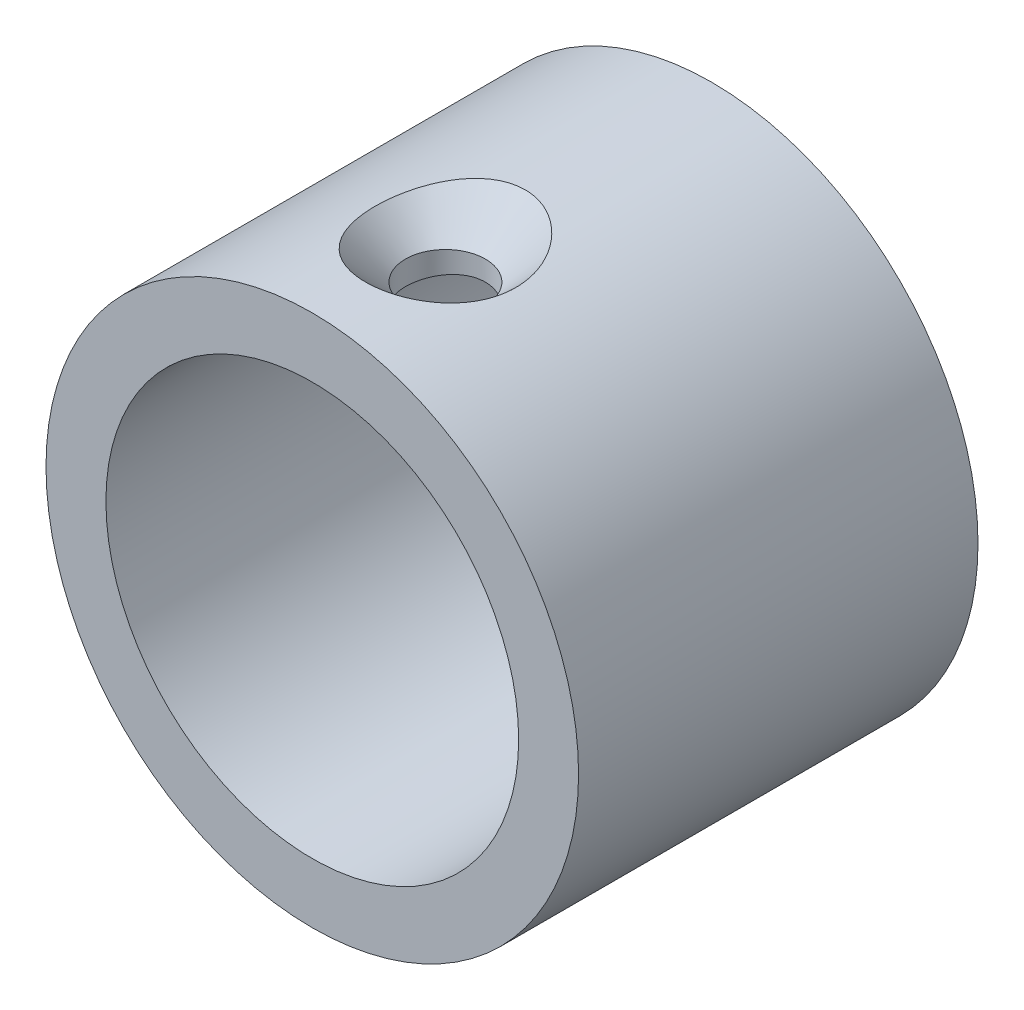
ISO-10303-21;
HEADER;
FILE_DESCRIPTION(('STEP AP214'),'2;1');
FILE_NAME('part.step','',(''),(''),'','','');
FILE_SCHEMA(('AUTOMOTIVE_DESIGN { 1 0 10303 214 1 1 1 1 }'));
ENDSEC;
DATA;
#1=APPLICATION_CONTEXT('core data for automotive mechanical design processes');
#2=APPLICATION_PROTOCOL_DEFINITION('international standard','automotive_design',2000,#1);
#3=PRODUCT_CONTEXT('',#1,'mechanical');
#4=PRODUCT('Part','Part','',(#3));
#5=PRODUCT_RELATED_PRODUCT_CATEGORY('part','',(#4));
#6=PRODUCT_DEFINITION_FORMATION('','',#4);
#7=PRODUCT_DEFINITION_CONTEXT('part definition',#1,'design');
#8=PRODUCT_DEFINITION('design','',#6,#7);
#9=PRODUCT_DEFINITION_SHAPE('','',#8);
#10=(LENGTH_UNIT() NAMED_UNIT(*) SI_UNIT(.MILLI.,.METRE.));
#11=(NAMED_UNIT(*) PLANE_ANGLE_UNIT() SI_UNIT($,.RADIAN.));
#12=(NAMED_UNIT(*) SI_UNIT($,.STERADIAN.) SOLID_ANGLE_UNIT());
#13=UNCERTAINTY_MEASURE_WITH_UNIT(LENGTH_MEASURE(1.E-05),#10,'distance_accuracy_value','');
#14=(GEOMETRIC_REPRESENTATION_CONTEXT(3) GLOBAL_UNCERTAINTY_ASSIGNED_CONTEXT((#13)) GLOBAL_UNIT_ASSIGNED_CONTEXT((#10,
#11,#12)) REPRESENTATION_CONTEXT('',''));
#15=CARTESIAN_POINT('',(0.,0.,0.));
#16=DIRECTION('',(0.,0.,1.));
#17=DIRECTION('',(1.,0.,0.));
#18=AXIS2_PLACEMENT_3D('',#15,#16,#17);
#19=CARTESIAN_POINT('',(0.,-1.11022302462516E-13,15.));
#20=DIRECTION('',(0.,0.,-1.));
#21=DIRECTION('',(-1.,0.,0.));
#22=AXIS2_PLACEMENT_3D('',#19,#20,#21);
#23=CYLINDRICAL_SURFACE('',#22,15.5);
#24=CARTESIAN_POINT('',(0.,15.5000000000001,7.99999999999995));
#25=CARTESIAN_POINT('',(-0.166842157427966,15.499996948164,7.99999373463535));
#26=CARTESIAN_POINT('',(-0.333764718614801,15.4972784289912,7.98603481731262));
#27=CARTESIAN_POINT('',(-0.662899184251405,15.4866958346927,7.93060790674575));
#28=CARTESIAN_POINT('',(-0.825107110075494,15.478827538276,7.88911734532683));
#29=CARTESIAN_POINT('',(-1.14000531508913,15.4588248154496,7.77995076067469));
#30=CARTESIAN_POINT('',(-1.29270428589321,15.4466943542873,7.71229907023018));
#31=CARTESIAN_POINT('',(-1.584571985674,15.4194891035625,7.55280123803706));
#32=CARTESIAN_POINT('',(-1.72374167048589,15.4044145222269,7.46095680719286));
#33=CARTESIAN_POINT('',(-1.9863833519088,15.3727681810538,7.25444093448922));
#34=CARTESIAN_POINT('',(-2.10965836266254,15.356181315792,7.1395212604454));
#35=CARTESIAN_POINT('',(-2.33530650469372,15.3234909013097,6.8906508609874));
#36=CARTESIAN_POINT('',(-2.43767807324439,15.3073873883011,6.75669871398735));
#37=CARTESIAN_POINT('',(-2.61944182004037,15.277339838046,6.47216181736862));
#38=CARTESIAN_POINT('',(-2.69863190503116,15.2634152580192,6.32144573343913));
#39=CARTESIAN_POINT('',(-2.83049059332961,15.2395158213961,6.00853375131921));
#40=CARTESIAN_POINT('',(-2.88316164147315,15.2295406007196,5.84633891294804));
#41=CARTESIAN_POINT('',(-2.95985143513911,15.2148217351821,5.5171868744315));
#42=CARTESIAN_POINT('',(-2.98421471391812,15.2100152367751,5.35031281492139));
#43=CARTESIAN_POINT('',(-3.00466715052272,15.205988677396,5.01478171365623));
#44=CARTESIAN_POINT('',(-3.00075901257164,15.2067680821199,4.84612484397186));
#45=CARTESIAN_POINT('',(-2.96505853774272,15.2137680971283,4.51432344159952));
#46=CARTESIAN_POINT('',(-2.93365948718622,15.2199119598443,4.35113473349615));
#47=CARTESIAN_POINT('',(-2.84448853402006,15.2368279427301,4.03238592998802));
#48=CARTESIAN_POINT('',(-2.78671544440239,15.2476002712105,3.87682617828628));
#49=CARTESIAN_POINT('',(-2.64605609709233,15.2726388046614,3.5766085829707));
#50=CARTESIAN_POINT('',(-2.56301242832955,15.2869267988358,3.43202638273262));
#51=CARTESIAN_POINT('',(-2.37428042851861,15.3173725601596,3.15870107799083));
#52=CARTESIAN_POINT('',(-2.26858965404571,15.3335305289764,3.02995968493304));
#53=CARTESIAN_POINT('',(-2.03545019647664,15.3662291402573,2.78969958237448));
#54=CARTESIAN_POINT('',(-1.90766546574733,15.3827716481717,2.67850695826146));
#55=CARTESIAN_POINT('',(-1.63508621521035,15.4141260938881,2.47908552820961));
#56=CARTESIAN_POINT('',(-1.49029150298899,15.4289380121101,2.39085698207241));
#57=CARTESIAN_POINT('',(-1.18745182950821,15.455195302749,2.23981431795428));
#58=CARTESIAN_POINT('',(-1.0293887211504,15.4666359646592,2.17703571449017));
#59=CARTESIAN_POINT('',(-0.704689196561309,15.4848256128898,2.07901322573999));
#60=CARTESIAN_POINT('',(-0.53805375408951,15.4915751308342,2.04376622037855));
#61=CARTESIAN_POINT('',(-0.203743604968224,15.4995484969183,2.00226504310537));
#62=CARTESIAN_POINT('',(-0.0361262957914658,15.5008574403624,1.99556434037485));
#63=CARTESIAN_POINT('',(0.297833265059787,15.4980378538656,2.01014592167347));
#64=CARTESIAN_POINT('',(0.464175583205138,15.4939096093551,2.03142673678491));
#65=CARTESIAN_POINT('',(0.789435450825461,15.4807326144716,2.10099614470907));
#66=CARTESIAN_POINT('',(0.948403476814254,15.4717253214162,2.14905728219946));
#67=CARTESIAN_POINT('',(1.25602495081128,15.4497962342172,2.27057576676314));
#68=CARTESIAN_POINT('',(1.40467766243839,15.436874160961,2.3440349246945));
#69=CARTESIAN_POINT('',(1.68934378804748,15.4083367239648,2.51524188455162));
#70=CARTESIAN_POINT('',(1.82519124255932,15.3926919549644,2.61326062437702));
#71=CARTESIAN_POINT('',(2.07866993264157,15.3605171123707,2.8304395692217));
#72=CARTESIAN_POINT('',(2.19629934544861,15.3439869504138,2.94960188715608));
#73=CARTESIAN_POINT('',(2.4117123454532,15.3116199014331,3.20771236560398));
#74=CARTESIAN_POINT('',(2.50919032448032,15.2957961959995,3.34691751282671));
#75=CARTESIAN_POINT('',(2.67938023850923,15.2669055094524,3.63998847715985));
#76=CARTESIAN_POINT('',(2.75209312933825,15.2538384219526,3.7938537281591));
#77=CARTESIAN_POINT('',(2.87026314421333,15.2320453568303,4.11112581716569));
#78=CARTESIAN_POINT('',(2.91585659894345,15.2232977036019,4.27448031878354));
#79=CARTESIAN_POINT('',(2.97891074851143,15.2110861081522,4.60671767852867));
#80=CARTESIAN_POINT('',(2.99637485106529,15.2076215259186,4.77559986447789));
#81=CARTESIAN_POINT('',(3.00255473934854,15.2064022777368,5.11103410478418));
#82=CARTESIAN_POINT('',(2.99175298257696,15.2085517861519,5.27757711155849));
#83=CARTESIAN_POINT('',(2.94276810273009,15.2181052690478,5.60642486132709));
#84=CARTESIAN_POINT('',(2.90458516935898,15.2255092071245,5.76872963367694));
#85=CARTESIAN_POINT('',(2.80213097225149,15.2446957641508,6.08421153742388));
#86=CARTESIAN_POINT('',(2.73791525329956,15.256469055947,6.23740731114776));
#87=CARTESIAN_POINT('',(2.58527230966198,15.2830737402167,6.53092687576328));
#88=CARTESIAN_POINT('',(2.49684322088532,15.2979053681177,6.67124967450493));
#89=CARTESIAN_POINT('',(2.29662044140757,15.3292510094655,6.93744995811736));
#90=CARTESIAN_POINT('',(2.18447690677593,15.3457880646324,7.06306164094173));
#91=CARTESIAN_POINT('',(1.9407347135171,15.3785122377946,7.2938442667665));
#92=CARTESIAN_POINT('',(1.80913159216237,15.3946992745404,7.39901050811008));
#93=CARTESIAN_POINT('',(1.52867568383951,15.4250840481721,7.58687409987819));
#94=CARTESIAN_POINT('',(1.37966809614722,15.4392609875134,7.66934383790452));
#95=CARTESIAN_POINT('',(1.06968135596581,15.4638244158092,7.80794448195346));
#96=CARTESIAN_POINT('',(0.908713391860636,15.4742143948633,7.86409965344656));
#97=CARTESIAN_POINT('',(0.622770386768138,15.4879623450641,7.93732505932674));
#98=CARTESIAN_POINT('',(0.499446623212571,15.4924505344118,7.96078717353864));
#99=CARTESIAN_POINT('',(0.250763676068821,15.4984704668632,7.99212677736904));
#100=CARTESIAN_POINT('',(0.125404550346819,15.5000022938695,8.00000470927273));
#101=CARTESIAN_POINT('',(0.,15.5000000000001,7.99999999999995));
#102=B_SPLINE_CURVE_WITH_KNOTS('',3,(#24,#25,#26,#27,#28,#29,#30,#31,#32,#33,#34,#35,#36,#37,
#38,#39,#40,#41,#42,#43,#44,#45,#46,#47,#48,#49,#50,#51,#52,#53,#54,#55,#56,#57,#58,#59,#60,#61,
#62,#63,#64,#65,#66,#67,#68,#69,#70,#71,#72,#73,#74,#75,#76,#77,#78,#79,#80,#81,#82,#83,#84,#85,
#86,#87,#88,#89,#90,#91,#92,#93,#94,#95,#96,#97,#98,#99,#100,#101),.UNSPECIFIED.,.T.,.F.,(4,2,2,
2,2,2,2,2,2,2,2,2,2,2,2,2,2,2,2,2,2,2,2,2,2,2,2,2,2,2,2,2,2,2,2,2,2,2,4),(0.,0.50006778655813,
1.00054599472548,1.50055981725489,2.00053828842381,2.50621507597948,3.01192965374993,
3.5219299583499,4.03188323652634,4.53556262536378,5.03919383679439,5.53573568336897,
6.03229987984826,6.53202279943104,7.03179966192038,7.53998224519339,8.04817057748541,
8.55706564795433,9.06590303846506,9.56675110957221,10.0675728892097,10.5642044495582,
11.060871426635,11.5632793855914,12.0657375793678,12.5753323838774,13.0849075179622,
13.5918988558482,14.0988287699066,14.5971627829493,15.0954933434327,15.592766191817,
16.0900773340282,16.5953127247585,17.1006641629152,17.6109127481924,18.1206898871514,
18.4965694413089,18.8724383277043),.UNSPECIFIED.);
#103=CARTESIAN_POINT('',(0.,15.5000000000001,7.99999999999995));
#104=VERTEX_POINT('',#103);
#105=EDGE_CURVE('E37',#104,#104,#102,.T.);
#106=ORIENTED_EDGE('',*,*,#105,.F.);
#107=EDGE_LOOP('',(#106));
#108=FACE_BOUND('',#107,.T.);
#109=CARTESIAN_POINT('',(0.,-1.11022302462516E-13,15.));
#110=DIRECTION('',(0.,0.,-1.));
#111=DIRECTION('',(1.,0.,0.));
#112=AXIS2_PLACEMENT_3D('',#109,#110,#111);
#113=CIRCLE('',#112,15.5);
#114=CARTESIAN_POINT('',(15.5,-1.34253719252797E-13,15.));
#115=VERTEX_POINT('',#114);
#116=EDGE_CURVE('E10',#115,#115,#113,.T.);
#117=ORIENTED_EDGE('',*,*,#116,.F.);
#118=EDGE_LOOP('',(#117));
#119=FACE_BOUND('',#118,.T.);
#120=CARTESIAN_POINT('',(4.44089209850063E-13,-3.33066907387547E-13,-15.0000000000001));
#121=DIRECTION('',(0.,0.,-1.));
#122=DIRECTION('',(1.,0.,0.));
#123=AXIS2_PLACEMENT_3D('',#120,#121,#122);
#124=CIRCLE('',#123,15.5);
#125=CARTESIAN_POINT('',(15.5000000000005,-3.56298324177828E-13,-15.));
#126=VERTEX_POINT('',#125);
#127=EDGE_CURVE('E26',#126,#126,#124,.T.);
#128=ORIENTED_EDGE('',*,*,#127,.T.);
#129=EDGE_LOOP('',(#128));
#130=FACE_BOUND('',#129,.T.);
#131=ADVANCED_FACE('F14',(#108,#119,#130),#23,.F.);
#132=CARTESIAN_POINT('',(0.,-1.11022302462516E-13,15.));
#133=DIRECTION('',(0.,0.,-1.));
#134=DIRECTION('',(-1.,0.,0.));
#135=AXIS2_PLACEMENT_3D('',#132,#133,#134);
#136=CYLINDRICAL_SURFACE('',#135,20.);
#137=CARTESIAN_POINT('',(-4.4260156111422,19.5041121138466,1.72805339375556));
#138=CARTESIAN_POINT('',(-4.51460594732798,19.4840084994002,1.88170713248954));
#139=CARTESIAN_POINT('',(-4.59660976123532,19.4647674683411,2.0392446963576));
#140=CARTESIAN_POINT('',(-4.74721450727494,19.4285860517931,2.36092504262204));
#141=CARTESIAN_POINT('',(-4.81581085962616,19.4116464530381,2.52507005901311));
#142=CARTESIAN_POINT('',(-4.93938948497811,19.3805701148185,2.85887050378123));
#143=CARTESIAN_POINT('',(-4.99435627538918,19.3664365665032,3.02853195346612));
#144=CARTESIAN_POINT('',(-5.09039596182385,19.3414149925463,3.37204346366767));
#145=CARTESIAN_POINT('',(-5.13146365141808,19.3305281832737,3.54589506769985));
#146=CARTESIAN_POINT('',(-5.19960662371508,19.3123105709696,3.89695731881611));
#147=CARTESIAN_POINT('',(-5.22664638818265,19.3049887973382,4.07417532606232));
#148=CARTESIAN_POINT('',(-5.26647686684826,19.2941609906851,4.43038474286673));
#149=CARTESIAN_POINT('',(-5.27926246477564,19.2906563277553,4.60937676593367));
#150=CARTESIAN_POINT('',(-5.2905111804254,19.2875743873263,4.96771642692102));
#151=CARTESIAN_POINT('',(-5.28898448554911,19.2879943163262,5.14706372106362));
#152=CARTESIAN_POINT('',(-5.27163627693439,19.2927429642587,5.50507929757878));
#153=CARTESIAN_POINT('',(-5.25580950166301,19.2970731219099,5.68374730571637));
#154=CARTESIAN_POINT('',(-5.2094984460719,19.3096274593391,6.04235739091274));
#155=CARTESIAN_POINT('',(-5.17875205398456,19.3179212319233,6.2222632554814));
#156=CARTESIAN_POINT('',(-5.10260800459844,19.3381731821322,6.57880502508561));
#157=CARTESIAN_POINT('',(-5.05720515633979,19.3501326579838,6.75543974809101));
#158=CARTESIAN_POINT('',(-4.95191977034455,19.3773436134913,7.10411532451887));
#159=CARTESIAN_POINT('',(-4.89203480888611,19.3925956441422,7.2761554036258));
#160=CARTESIAN_POINT('',(-4.75801508246824,19.4259120177889,7.61430931106661));
#161=CARTESIAN_POINT('',(-4.68388085172908,19.4439762553473,7.78042336129689));
#162=CARTESIAN_POINT('',(-4.52232123070088,19.4821826069655,8.10403014275748));
#163=CARTESIAN_POINT('',(-4.43501433202277,19.5023057276181,8.26158421740204));
#164=CARTESIAN_POINT('',(-4.24700803674685,19.5441088016919,8.56818602384206));
#165=CARTESIAN_POINT('',(-4.14631461519155,19.5657880585608,8.71723750857541));
#166=CARTESIAN_POINT('',(-3.93183364591797,19.6100146867916,9.00559148653741));
#167=CARTESIAN_POINT('',(-3.81803995528791,19.6325624620903,9.14488935651054));
#168=CARTESIAN_POINT('',(-3.57793696280021,19.6777354945794,9.41211743971777));
#169=CARTESIAN_POINT('',(-3.45163488011778,19.7003606998849,9.54005413007271));
#170=CARTESIAN_POINT('',(-3.19543384845572,19.7434797488704,9.77542156613769));
#171=CARTESIAN_POINT('',(-3.06626334076158,19.7640180487561,9.88363652819323));
#172=CARTESIAN_POINT('',(-2.79819033488612,19.8037489226803,10.0873922957867));
#173=CARTESIAN_POINT('',(-2.6592938801579,19.8229423178301,10.1829408669494));
#174=CARTESIAN_POINT('',(-2.37270394534761,19.8592828975,10.3599896504111));
#175=CARTESIAN_POINT('',(-2.2250177560268,19.8764317433919,10.4415012931903));
#176=CARTESIAN_POINT('',(-1.92189823555432,19.9080261235741,10.5892074320939));
#177=CARTESIAN_POINT('',(-1.76646641524295,19.9224721824687,10.655404901253));
#178=CARTESIAN_POINT('',(-1.47104004277857,19.9463003680253,10.7633009873885));
#179=CARTESIAN_POINT('',(-1.33184933727892,19.9561051744189,10.8071138268156));
#180=CARTESIAN_POINT('',(-1.04986896609878,19.9729245899801,10.8817342363817));
#181=CARTESIAN_POINT('',(-0.907079878130179,19.9799396440393,10.9125438802339));
#182=CARTESIAN_POINT('',(-0.619211514271696,19.9909301823456,10.9606258320835));
#183=CARTESIAN_POINT('',(-0.474133889049823,19.9949077635483,10.9779074795013));
#184=CARTESIAN_POINT('',(-0.182990035579173,19.9996942239432,10.9986807233436));
#185=CARTESIAN_POINT('',(-0.0369238917850804,20.0005033704928,11.002173483296));
#186=CARTESIAN_POINT('',(0.366818699261424,19.9982888321095,10.9925983524157));
#187=CARTESIAN_POINT('',(0.624283800831994,19.9918544424121,10.9647956732334));
#188=CARTESIAN_POINT('',(1.13051529480333,19.969635521466,10.867276093154));
#189=CARTESIAN_POINT('',(1.37928189784597,19.9538512168001,10.7975602079674));
#190=CARTESIAN_POINT('',(1.86178971094694,19.9146257394446,10.6198037671321));
#191=CARTESIAN_POINT('',(2.09554123077753,19.8911898892513,10.5117898475241));
#192=CARTESIAN_POINT('',(2.54349014235319,19.8388917617844,10.2619840271601));
#193=CARTESIAN_POINT('',(2.75768145144399,19.8100278050071,10.1201816683295));
#194=CARTESIAN_POINT('',(3.18365405751274,19.7462733979472,9.79189581576482));
#195=CARTESIAN_POINT('',(3.39302466563904,19.7110687934155,9.60235229614918));
#196=CARTESIAN_POINT('',(3.78130017578928,19.6402852259222,9.19436875304565));
#197=CARTESIAN_POINT('',(3.96018932761539,19.6047060794499,8.97591389361273));
#198=CARTESIAN_POINT('',(4.30729387107776,19.5315843147276,8.48512266348583));
#199=CARTESIAN_POINT('',(4.47091831288467,19.4944108117375,8.20948480848057));
#200=CARTESIAN_POINT('',(4.75477395473623,19.4271333800718,7.63574655203267));
#201=CARTESIAN_POINT('',(4.87498651948316,19.3970324893695,7.33763657025554));
#202=CARTESIAN_POINT('',(5.02630349623797,19.3581826141787,6.86472466133484));
#203=CARTESIAN_POINT('',(5.07312904176545,19.3459310553994,6.69506147187431));
#204=CARTESIAN_POINT('',(5.15316205652546,19.3247680637123,6.35236204399949));
#205=CARTESIAN_POINT('',(5.18637333428305,19.3158556967419,6.17932676311975));
#206=CARTESIAN_POINT('',(5.23906500563223,19.3016304402848,5.83095861655198));
#207=CARTESIAN_POINT('',(5.25853890918654,19.2963192521725,5.65562470469582));
#208=CARTESIAN_POINT('',(5.28365584121472,19.2894570111801,5.30395277927862));
#209=CARTESIAN_POINT('',(5.28930338955928,19.2879047295057,5.12761511274695));
#210=CARTESIAN_POINT('',(5.28671436204121,19.2886146662076,4.76921035760587));
#211=CARTESIAN_POINT('',(5.27801228551845,19.2910047761715,4.5871467176984));
#212=CARTESIAN_POINT('',(5.24587165156182,19.2997695990619,4.22442207018596));
#213=CARTESIAN_POINT('',(5.22243306374007,19.3061443202049,4.04376106547411));
#214=CARTESIAN_POINT('',(5.16091041244556,19.3226814224337,3.68509056328519));
#215=CARTESIAN_POINT('',(5.1228236835419,19.3328444928515,3.50708155450231));
#216=CARTESIAN_POINT('',(5.0321576541232,19.3566418572841,3.15503401650271));
#217=CARTESIAN_POINT('',(4.97957878338879,19.3702760483583,2.98099536970619));
#218=CARTESIAN_POINT('',(4.86009058590827,19.4006009948769,2.63805735860459));
#219=CARTESIAN_POINT('',(4.79317240770091,19.4172936373356,2.46916124259627));
#220=CARTESIAN_POINT('',(4.64530030447129,19.4531994501786,2.13798674457522));
#221=CARTESIAN_POINT('',(4.56435228031412,19.4724115600674,1.97570561564316));
#222=CARTESIAN_POINT('',(4.38863322009653,19.5127657595541,1.65890583444948));
#223=CARTESIAN_POINT('',(4.29385295417255,19.5339091342783,1.50439245867838));
#224=CARTESIAN_POINT('',(4.09090790742876,19.5774164032439,1.20469947003106));
#225=CARTESIAN_POINT('',(3.98274986201705,19.5997796801475,1.05951521565317));
#226=CARTESIAN_POINT('',(3.75758440139841,19.6441656309288,0.784899374143944));
#227=CARTESIAN_POINT('',(3.64103665462933,19.6661715135901,0.655088557821376));
#228=CARTESIAN_POINT('',(3.39643503909554,19.709887102953,0.406863455049066));
#229=CARTESIAN_POINT('',(3.26838769363483,19.7315969696228,0.288442785363697));
#230=CARTESIAN_POINT('',(3.00140706094244,19.7739681287339,0.0643969086672229));
#231=CARTESIAN_POINT('',(2.86247584883097,19.7946296198269,-0.0412307277357323));
#232=CARTESIAN_POINT('',(2.57465174212899,19.8341180716413,-0.238137757595806));
#233=CARTESIAN_POINT('',(2.42576578839904,19.8529462885571,-0.329427002666143));
#234=CARTESIAN_POINT('',(2.13663918577267,19.8860115731167,-0.48667144972237));
#235=CARTESIAN_POINT('',(1.99735589609606,19.9005274325705,-0.55432975545992));
#236=CARTESIAN_POINT('',(1.71288323665783,19.9270274207086,-0.676216954107341));
#237=CARTESIAN_POINT('',(1.56769757101586,19.9390131088582,-0.730454122676173));
#238=CARTESIAN_POINT('',(1.27264677688616,19.9600150001509,-0.824601652316473));
#239=CARTESIAN_POINT('',(1.12278544238606,19.9690335456747,-0.864523316867569));
#240=CARTESIAN_POINT('',(0.819751914153408,19.9837704685598,-0.929376479655193));
#241=CARTESIAN_POINT('',(0.666580207740336,19.9894893282804,-0.954310168907339));
#242=CARTESIAN_POINT('',(0.247250032822336,20.0002207447867,-1.00103882771599));
#243=CARTESIAN_POINT('',(-0.0208675341467047,20.001761174062,-1.00765295578473));
#244=CARTESIAN_POINT('',(-0.553837194362843,19.9941100427981,-0.97444371704513));
#245=CARTESIAN_POINT('',(-0.81869014693283,19.9849213701245,-0.93463284608167));
#246=CARTESIAN_POINT('',(-1.32478533954429,19.9576080987451,-0.813970699546653));
#247=CARTESIAN_POINT('',(-1.56655049629104,19.9399345356813,-0.735185385072758));
#248=CARTESIAN_POINT('',(-2.03442229617997,19.897648159806,-0.541399162316378));
#249=CARTESIAN_POINT('',(-2.26052323773137,19.8730328366341,-0.426385150826135));
#250=CARTESIAN_POINT('',(-2.70794265760364,19.8172000379988,-0.155495683482884));
#251=CARTESIAN_POINT('',(-2.92782268398771,19.7856413926481,0.00267363696186088));
#252=CARTESIAN_POINT('',(-3.34129037227304,19.7200318896529,0.349594029846416));
#253=CARTESIAN_POINT('',(-3.53488563519517,19.6859817568981,0.538336226457636));
#254=CARTESIAN_POINT('',(-3.84943666413198,19.6265326945879,0.891420752870005));
#255=CARTESIAN_POINT('',(-3.97654707456823,19.6010658103122,1.05034637146246));
#256=CARTESIAN_POINT('',(-4.21400289845115,19.5513912159219,1.38049324860475));
#257=CARTESIAN_POINT('',(-4.32434666147472,19.5271836299204,1.55171571515366));
#258=CARTESIAN_POINT('',(-4.4260156111422,19.5041121138466,1.72805339375556));
#259=B_SPLINE_CURVE_WITH_KNOTS('',3,(#137,#138,#139,#140,#141,#142,#143,#144,#145,#146,#147,
#148,#149,#150,#151,#152,#153,#154,#155,#156,#157,#158,#159,#160,#161,#162,#163,#164,#165,#166,
#167,#168,#169,#170,#171,#172,#173,#174,#175,#176,#177,#178,#179,#180,#181,#182,#183,#184,#185,
#186,#187,#188,#189,#190,#191,#192,#193,#194,#195,#196,#197,#198,#199,#200,#201,#202,#203,#204,
#205,#206,#207,#208,#209,#210,#211,#212,#213,#214,#215,#216,#217,#218,#219,#220,#221,#222,#223,
#224,#225,#226,#227,#228,#229,#230,#231,#232,#233,#234,#235,#236,#237,#238,#239,#240,#241,#242,
#243,#244,#245,#246,#247,#248,#249,#250,#251,#252,#253,#254,#255,#256,#257,#258),.UNSPECIFIED.,
.T.,.F.,(4,2,2,2,2,2,2,2,2,2,2,2,2,2,2,2,2,2,2,2,2,2,2,2,2,2,2,2,2,2,2,2,2,2,2,2,2,2,2,2,2,2,2,
2,2,2,2,2,2,2,2,2,2,2,2,2,2,2,2,2,4),(0.,0.53529906008591,1.07078065169741,1.60686776876923,
2.14315547568835,2.68079449821904,3.21862643431293,3.75607557405048,4.293722541935,
4.84117712244107,5.38882581115613,5.93656621768769,6.48428609285274,7.0273443060286,
7.57016093522221,8.11323314403763,8.65599372722672,9.16454521479946,9.67278345869517,
10.1806058592037,10.6883295901367,11.1264680155043,11.564536541354,12.0023023672975,
12.4400312530868,13.2130591067407,13.9860682278552,14.7585407771965,15.5312527307196,
16.3817088197499,17.2326030275176,18.1967679211962,19.1613462086965,19.6901402999812,
20.2187863625803,20.747682009925,21.276404736837,21.8226188648161,22.3688341191366,
22.9151488119016,23.4614473048377,24.0080839969483,24.5544913325681,25.1012649516716,
25.6477643947787,26.1745597036299,26.7010580457851,27.2274562488295,27.7534911772592,
28.219392057758,28.6850049374279,29.1502493567741,29.6154257478627,30.4154736009177,
31.2153061611994,31.9766701478009,32.7383098215919,33.5531761002721,34.367806231949,
34.9820712001298,35.5963965942991),.UNSPECIFIED.);
#260=CARTESIAN_POINT('',(-4.4260156111422,19.5041121138466,1.72805339375556));
#261=VERTEX_POINT('',#260);
#262=EDGE_CURVE('E44',#261,#261,#259,.T.);
#263=ORIENTED_EDGE('',*,*,#262,.F.);
#264=EDGE_LOOP('',(#263));
#265=FACE_BOUND('',#264,.T.);
#266=CARTESIAN_POINT('',(4.44089209850063E-13,-3.33066907387547E-13,-15.0000000000001));
#267=DIRECTION('',(0.,0.,-1.));
#268=DIRECTION('',(1.,0.,0.));
#269=AXIS2_PLACEMENT_3D('',#266,#267,#268);
#270=CIRCLE('',#269,20.);
#271=CARTESIAN_POINT('',(20.0000000000005,-3.63042929052426E-13,-15.));
#272=VERTEX_POINT('',#271);
#273=EDGE_CURVE('E31',#272,#272,#270,.T.);
#274=ORIENTED_EDGE('',*,*,#273,.F.);
#275=EDGE_LOOP('',(#274));
#276=FACE_BOUND('',#275,.T.);
#277=CARTESIAN_POINT('',(0.,-1.11022302462516E-13,15.));
#278=DIRECTION('',(0.,0.,-1.));
#279=DIRECTION('',(1.,0.,0.));
#280=AXIS2_PLACEMENT_3D('',#277,#278,#279);
#281=CIRCLE('',#280,20.);
#282=CARTESIAN_POINT('',(20.,-1.40998324127395E-13,15.));
#283=VERTEX_POINT('',#282);
#284=EDGE_CURVE('E22',#283,#283,#281,.T.);
#285=ORIENTED_EDGE('',*,*,#284,.T.);
#286=EDGE_LOOP('',(#285));
#287=FACE_BOUND('',#286,.T.);
#288=ADVANCED_FACE('F16',(#265,#276,#287),#136,.T.);
#289=CARTESIAN_POINT('',(0.,-1.11022302462516E-13,15.));
#290=DIRECTION('',(0.,0.,-1.));
#291=DIRECTION('',(-1.,0.,0.));
#292=AXIS2_PLACEMENT_3D('',#289,#290,#291);
#293=PLANE('',#292);
#294=ORIENTED_EDGE('',*,*,#116,.T.);
#295=EDGE_LOOP('',(#294));
#296=FACE_BOUND('',#295,.T.);
#297=ORIENTED_EDGE('',*,*,#284,.F.);
#298=EDGE_LOOP('',(#297));
#299=FACE_BOUND('',#298,.T.);
#300=ADVANCED_FACE('F70',(#296,#299),#293,.F.);
#301=CARTESIAN_POINT('',(4.44089209850063E-13,-3.33066907387547E-13,-15.0000000000001));
#302=DIRECTION('',(0.,0.,-1.));
#303=DIRECTION('',(-1.,0.,0.));
#304=AXIS2_PLACEMENT_3D('',#301,#302,#303);
#305=PLANE('',#304);
#306=ORIENTED_EDGE('',*,*,#127,.F.);
#307=EDGE_LOOP('',(#306));
#308=FACE_BOUND('',#307,.T.);
#309=ORIENTED_EDGE('',*,*,#273,.T.);
#310=EDGE_LOOP('',(#309));
#311=FACE_BOUND('',#310,.T.);
#312=ADVANCED_FACE('F55',(#308,#311),#305,.T.);
#313=CARTESIAN_POINT('',(0.,-47.0312423743285,5.));
#314=DIRECTION('',(0.,1.,0.));
#315=DIRECTION('',(0.,0.,1.));
#316=AXIS2_PLACEMENT_3D('',#313,#314,#315);
#317=CYLINDRICAL_SURFACE('',#316,3.);
#318=ORIENTED_EDGE('',*,*,#105,.T.);
#319=EDGE_LOOP('',(#318));
#320=FACE_BOUND('',#319,.T.);
#321=CARTESIAN_POINT('',(0.,16.9999999999999,4.99999999999995));
#322=DIRECTION('',(0.,1.,0.));
#323=DIRECTION('',(0.,0.,-1.));
#324=AXIS2_PLACEMENT_3D('',#321,#322,#323);
#325=CIRCLE('',#324,3.);
#326=CARTESIAN_POINT('',(0.,16.9999999999999,1.99999999999995));
#327=VERTEX_POINT('',#326);
#328=EDGE_CURVE('E169',#327,#327,#325,.T.);
#329=ORIENTED_EDGE('',*,*,#328,.T.);
#330=EDGE_LOOP('',(#329));
#331=FACE_BOUND('',#330,.T.);
#332=ADVANCED_FACE('F51',(#320,#331),#317,.F.);
#333=CARTESIAN_POINT('',(-8.88178419700125E-13,20.,4.99999999999995));
#334=DIRECTION('',(0.,1.,0.));
#335=DIRECTION('',(0.,0.,-1.));
#336=AXIS2_PLACEMENT_3D('',#333,#334,#335);
#337=CONICAL_SURFACE('',#336,6.,0.785398163397448);
#338=ORIENTED_EDGE('',*,*,#262,.T.);
#339=EDGE_LOOP('',(#338));
#340=FACE_BOUND('',#339,.T.);
#341=ORIENTED_EDGE('',*,*,#328,.F.);
#342=EDGE_LOOP('',(#341));
#343=FACE_BOUND('',#342,.T.);
#344=ADVANCED_FACE('F54',(#340,#343),#337,.F.);
#345=CLOSED_SHELL('',(#131,#288,#300,#312,#332,#344));
#346=MANIFOLD_SOLID_BREP('B1',#345);
#347=ADVANCED_BREP_SHAPE_REPRESENTATION('',(#18,#346),#14);
#348=SHAPE_DEFINITION_REPRESENTATION(#9,#347);
ENDSEC;
END-ISO-10303-21;
